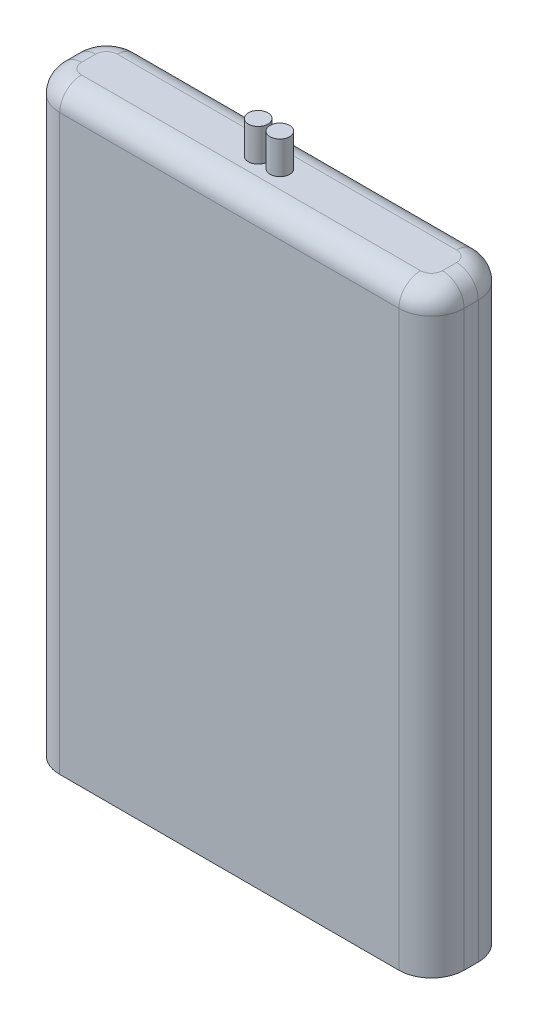
ISO-10303-21;
HEADER;
FILE_DESCRIPTION(('STEP AP214'),'2;1');
FILE_NAME('part.step','',(''),(''),'','','');
FILE_SCHEMA(('AUTOMOTIVE_DESIGN { 1 0 10303 214 1 1 1 1 }'));
ENDSEC;
DATA;
#1=APPLICATION_CONTEXT('core data for automotive mechanical design processes');
#2=APPLICATION_PROTOCOL_DEFINITION('international standard','automotive_design',2000,#1);
#3=PRODUCT_CONTEXT('',#1,'mechanical');
#4=PRODUCT('Part','Part','',(#3));
#5=PRODUCT_RELATED_PRODUCT_CATEGORY('part','',(#4));
#6=PRODUCT_DEFINITION_FORMATION('','',#4);
#7=PRODUCT_DEFINITION_CONTEXT('part definition',#1,'design');
#8=PRODUCT_DEFINITION('design','',#6,#7);
#9=PRODUCT_DEFINITION_SHAPE('','',#8);
#10=(LENGTH_UNIT() NAMED_UNIT(*) SI_UNIT(.MILLI.,.METRE.));
#11=(NAMED_UNIT(*) PLANE_ANGLE_UNIT() SI_UNIT($,.RADIAN.));
#12=(NAMED_UNIT(*) SI_UNIT($,.STERADIAN.) SOLID_ANGLE_UNIT());
#13=UNCERTAINTY_MEASURE_WITH_UNIT(LENGTH_MEASURE(1.E-05),#10,'distance_accuracy_value','');
#14=(GEOMETRIC_REPRESENTATION_CONTEXT(3) GLOBAL_UNCERTAINTY_ASSIGNED_CONTEXT((#13)) GLOBAL_UNIT_ASSIGNED_CONTEXT((#10,
#11,#12)) REPRESENTATION_CONTEXT('',''));
#15=CARTESIAN_POINT('',(0.,0.,0.));
#16=DIRECTION('',(0.,0.,1.));
#17=DIRECTION('',(1.,0.,0.));
#18=AXIS2_PLACEMENT_3D('',#15,#16,#17);
#19=CARTESIAN_POINT('',(18.58,27.335,3.65));
#20=DIRECTION('',(-1.,0.,0.));
#21=DIRECTION('',(0.,-1.,0.));
#22=AXIS2_PLACEMENT_3D('',#19,#20,#21);
#23=PLANE('',#22);
#24=DIRECTION('',(0.,1.,0.));
#25=VECTOR('',#24,1.);
#26=CARTESIAN_POINT('',(18.58,27.335,-0.65));
#27=LINE('',#26,#25);
#28=CARTESIAN_POINT('',(18.58,-27.335,-0.65));
#29=VERTEX_POINT('',#28);
#30=CARTESIAN_POINT('',(18.58,25.335,-0.65));
#31=VERTEX_POINT('',#30);
#32=EDGE_CURVE('E184',#29,#31,#27,.T.);
#33=ORIENTED_EDGE('',*,*,#32,.T.);
#34=DIRECTION('',(0.,0.,-1.));
#35=VECTOR('',#34,1.);
#36=CARTESIAN_POINT('',(18.58,25.335,3.65));
#37=LINE('',#36,#35);
#38=CARTESIAN_POINT('',(18.58,25.335,0.65));
#39=VERTEX_POINT('',#38);
#40=EDGE_CURVE('E217',#31,#39,#37,.F.);
#41=ORIENTED_EDGE('',*,*,#40,.T.);
#42=DIRECTION('',(0.,1.,0.));
#43=VECTOR('',#42,1.);
#44=CARTESIAN_POINT('',(18.58,-27.335,0.65));
#45=LINE('',#44,#43);
#46=CARTESIAN_POINT('',(18.58,-27.335,0.65));
#47=VERTEX_POINT('',#46);
#48=EDGE_CURVE('E181',#39,#47,#45,.F.);
#49=ORIENTED_EDGE('',*,*,#48,.T.);
#50=DIRECTION('',(0.,0.,-1.));
#51=VECTOR('',#50,1.);
#52=CARTESIAN_POINT('',(18.58,-27.335,3.65));
#53=LINE('',#52,#51);
#54=EDGE_CURVE('E152',#47,#29,#53,.T.);
#55=ORIENTED_EDGE('',*,*,#54,.T.);
#56=EDGE_LOOP('',(#33,#41,#49,#55));
#57=FACE_BOUND('',#56,.T.);
#58=ADVANCED_FACE('F41',(#57),#23,.F.);
#59=CARTESIAN_POINT('',(-18.58,27.335,3.65));
#60=DIRECTION('',(0.,-1.,0.));
#61=DIRECTION('',(0.,0.,-1.));
#62=AXIS2_PLACEMENT_3D('',#59,#60,#61);
#63=PLANE('',#62);
#64=CARTESIAN_POINT('',(1.,27.335,0.));
#65=DIRECTION('',(0.,-1.,0.));
#66=DIRECTION('',(0.,0.,-1.));
#67=AXIS2_PLACEMENT_3D('',#64,#65,#66);
#68=CIRCLE('',#67,0.900344027034095);
#69=CARTESIAN_POINT('',(1.,27.335,-0.900344027034095));
#70=VERTEX_POINT('',#69);
#71=EDGE_CURVE('E11',#70,#70,#68,.F.);
#72=ORIENTED_EDGE('',*,*,#71,.F.);
#73=EDGE_LOOP('',(#72));
#74=FACE_BOUND('',#73,.T.);
#75=CARTESIAN_POINT('',(-1.,27.335,0.));
#76=DIRECTION('',(0.,-1.,0.));
#77=DIRECTION('',(0.,0.,-1.));
#78=AXIS2_PLACEMENT_3D('',#75,#76,#77);
#79=CIRCLE('',#78,0.900344027034095);
#80=CARTESIAN_POINT('',(-1.,27.335,-0.900344027034095));
#81=VERTEX_POINT('',#80);
#82=EDGE_CURVE('E50',#81,#81,#79,.F.);
#83=ORIENTED_EDGE('',*,*,#82,.F.);
#84=EDGE_LOOP('',(#83));
#85=FACE_BOUND('',#84,.T.);
#86=DIRECTION('',(-1.,0.,0.));
#87=VECTOR('',#86,1.);
#88=CARTESIAN_POINT('',(15.58,27.335,1.65));
#89=LINE('',#88,#87);
#90=CARTESIAN_POINT('',(-15.58,27.335,1.65));
#91=VERTEX_POINT('',#90);
#92=CARTESIAN_POINT('',(15.58,27.335,1.65));
#93=VERTEX_POINT('',#92);
#94=EDGE_CURVE('E188',#91,#93,#89,.F.);
#95=ORIENTED_EDGE('',*,*,#94,.T.);
#96=CARTESIAN_POINT('',(15.58,27.335,0.65));
#97=DIRECTION('',(0.,-1.,0.));
#98=DIRECTION('',(0.,0.,-1.));
#99=AXIS2_PLACEMENT_3D('',#96,#97,#98);
#100=CIRCLE('',#99,1.);
#101=CARTESIAN_POINT('',(16.58,27.335,0.65));
#102=VERTEX_POINT('',#101);
#103=EDGE_CURVE('E209',#93,#102,#100,.F.);
#104=ORIENTED_EDGE('',*,*,#103,.T.);
#105=DIRECTION('',(0.,0.,-1.));
#106=VECTOR('',#105,1.);
#107=CARTESIAN_POINT('',(16.58,27.335,3.65));
#108=LINE('',#107,#106);
#109=CARTESIAN_POINT('',(16.58,27.335,-0.65));
#110=VERTEX_POINT('',#109);
#111=EDGE_CURVE('E206',#102,#110,#108,.T.);
#112=ORIENTED_EDGE('',*,*,#111,.T.);
#113=CARTESIAN_POINT('',(15.58,27.335,-0.65));
#114=DIRECTION('',(0.,-1.,0.));
#115=DIRECTION('',(0.,0.,-1.));
#116=AXIS2_PLACEMENT_3D('',#113,#114,#115);
#117=CIRCLE('',#116,1.);
#118=CARTESIAN_POINT('',(15.58,27.335,-1.65));
#119=VERTEX_POINT('',#118);
#120=EDGE_CURVE('E203',#110,#119,#117,.F.);
#121=ORIENTED_EDGE('',*,*,#120,.T.);
#122=DIRECTION('',(-1.,0.,0.));
#123=VECTOR('',#122,1.);
#124=CARTESIAN_POINT('',(-18.58,27.335,-1.65));
#125=LINE('',#124,#123);
#126=CARTESIAN_POINT('',(-15.58,27.335,-1.65));
#127=VERTEX_POINT('',#126);
#128=EDGE_CURVE('E200',#119,#127,#125,.T.);
#129=ORIENTED_EDGE('',*,*,#128,.T.);
#130=CARTESIAN_POINT('',(-15.58,27.335,-0.65));
#131=DIRECTION('',(0.,-1.,0.));
#132=DIRECTION('',(0.,0.,-1.));
#133=AXIS2_PLACEMENT_3D('',#130,#131,#132);
#134=CIRCLE('',#133,1.);
#135=CARTESIAN_POINT('',(-16.58,27.335,-0.65));
#136=VERTEX_POINT('',#135);
#137=EDGE_CURVE('E197',#127,#136,#134,.F.);
#138=ORIENTED_EDGE('',*,*,#137,.T.);
#139=DIRECTION('',(0.,0.,-1.));
#140=VECTOR('',#139,1.);
#141=CARTESIAN_POINT('',(-16.58,27.335,3.65));
#142=LINE('',#141,#140);
#143=CARTESIAN_POINT('',(-16.58,27.335,0.65));
#144=VERTEX_POINT('',#143);
#145=EDGE_CURVE('E194',#136,#144,#142,.F.);
#146=ORIENTED_EDGE('',*,*,#145,.T.);
#147=CARTESIAN_POINT('',(-15.58,27.335,0.65));
#148=DIRECTION('',(0.,-1.,0.));
#149=DIRECTION('',(0.,0.,-1.));
#150=AXIS2_PLACEMENT_3D('',#147,#148,#149);
#151=CIRCLE('',#150,1.);
#152=EDGE_CURVE('E191',#144,#91,#151,.F.);
#153=ORIENTED_EDGE('',*,*,#152,.T.);
#154=EDGE_LOOP('',(#95,#104,#112,#121,#129,#138,#146,#153));
#155=FACE_BOUND('',#154,.T.);
#156=ADVANCED_FACE('F273',(#74,#85,#155),#63,.F.);
#157=CARTESIAN_POINT('',(-18.58,27.335,3.65));
#158=DIRECTION('',(1.,0.,0.));
#159=DIRECTION('',(0.,1.,0.));
#160=AXIS2_PLACEMENT_3D('',#157,#158,#159);
#161=PLANE('',#160);
#162=DIRECTION('',(0.,-1.,0.));
#163=VECTOR('',#162,1.);
#164=CARTESIAN_POINT('',(-18.58,27.335,0.65));
#165=LINE('',#164,#163);
#166=CARTESIAN_POINT('',(-18.58,-27.335,0.65));
#167=VERTEX_POINT('',#166);
#168=CARTESIAN_POINT('',(-18.58,25.335,0.65));
#169=VERTEX_POINT('',#168);
#170=EDGE_CURVE('E146',#167,#169,#165,.F.);
#171=ORIENTED_EDGE('',*,*,#170,.T.);
#172=DIRECTION('',(0.,0.,-1.));
#173=VECTOR('',#172,1.);
#174=CARTESIAN_POINT('',(-18.58,25.335,3.65));
#175=LINE('',#174,#173);
#176=CARTESIAN_POINT('',(-18.58,25.335,-0.65));
#177=VERTEX_POINT('',#176);
#178=EDGE_CURVE('E229',#169,#177,#175,.T.);
#179=ORIENTED_EDGE('',*,*,#178,.T.);
#180=DIRECTION('',(0.,-1.,0.));
#181=VECTOR('',#180,1.);
#182=CARTESIAN_POINT('',(-18.58,27.335,-0.65));
#183=LINE('',#182,#181);
#184=CARTESIAN_POINT('',(-18.58,-27.335,-0.65));
#185=VERTEX_POINT('',#184);
#186=EDGE_CURVE('E149',#177,#185,#183,.T.);
#187=ORIENTED_EDGE('',*,*,#186,.T.);
#188=DIRECTION('',(0.,0.,-1.));
#189=VECTOR('',#188,1.);
#190=CARTESIAN_POINT('',(-18.58,-27.335,3.65));
#191=LINE('',#190,#189);
#192=EDGE_CURVE('E137',#167,#185,#191,.T.);
#193=ORIENTED_EDGE('',*,*,#192,.F.);
#194=EDGE_LOOP('',(#171,#179,#187,#193));
#195=FACE_BOUND('',#194,.T.);
#196=ADVANCED_FACE('F145',(#195),#161,.F.);
#197=CARTESIAN_POINT('',(-18.58,-27.335,3.65));
#198=DIRECTION('',(0.,1.,0.));
#199=DIRECTION('',(0.,0.,1.));
#200=AXIS2_PLACEMENT_3D('',#197,#198,#199);
#201=PLANE('',#200);
#202=ORIENTED_EDGE('',*,*,#192,.T.);
#203=CARTESIAN_POINT('',(-15.58,-27.335,-0.65));
#204=DIRECTION('',(0.,1.,0.));
#205=DIRECTION('',(0.,0.,1.));
#206=AXIS2_PLACEMENT_3D('',#203,#204,#205);
#207=CIRCLE('',#206,3.);
#208=CARTESIAN_POINT('',(-15.58,-27.335,-3.65));
#209=VERTEX_POINT('',#208);
#210=EDGE_CURVE('E141',#185,#209,#207,.F.);
#211=ORIENTED_EDGE('',*,*,#210,.T.);
#212=DIRECTION('',(1.,0.,0.));
#213=VECTOR('',#212,1.);
#214=CARTESIAN_POINT('',(-18.58,-27.335,-3.65));
#215=LINE('',#214,#213);
#216=CARTESIAN_POINT('',(15.58,-27.335,-3.65));
#217=VERTEX_POINT('',#216);
#218=EDGE_CURVE('E266',#209,#217,#215,.T.);
#219=ORIENTED_EDGE('',*,*,#218,.T.);
#220=CARTESIAN_POINT('',(15.58,-27.335,-0.65));
#221=DIRECTION('',(0.,1.,0.));
#222=DIRECTION('',(0.,0.,1.));
#223=AXIS2_PLACEMENT_3D('',#220,#221,#222);
#224=CIRCLE('',#223,3.);
#225=EDGE_CURVE('E142',#217,#29,#224,.F.);
#226=ORIENTED_EDGE('',*,*,#225,.T.);
#227=ORIENTED_EDGE('',*,*,#54,.F.);
#228=CARTESIAN_POINT('',(15.58,-27.335,0.65));
#229=DIRECTION('',(0.,1.,0.));
#230=DIRECTION('',(0.,0.,1.));
#231=AXIS2_PLACEMENT_3D('',#228,#229,#230);
#232=CIRCLE('',#231,3.);
#233=CARTESIAN_POINT('',(15.58,-27.335,3.65));
#234=VERTEX_POINT('',#233);
#235=EDGE_CURVE('E158',#47,#234,#232,.F.);
#236=ORIENTED_EDGE('',*,*,#235,.T.);
#237=DIRECTION('',(1.,0.,0.));
#238=VECTOR('',#237,1.);
#239=CARTESIAN_POINT('',(-18.58,-27.335,3.65));
#240=LINE('',#239,#238);
#241=CARTESIAN_POINT('',(-15.58,-27.335,3.65));
#242=VERTEX_POINT('',#241);
#243=EDGE_CURVE('E139',#242,#234,#240,.T.);
#244=ORIENTED_EDGE('',*,*,#243,.F.);
#245=CARTESIAN_POINT('',(-15.58,-27.335,0.65));
#246=DIRECTION('',(0.,1.,0.));
#247=DIRECTION('',(0.,0.,1.));
#248=AXIS2_PLACEMENT_3D('',#245,#246,#247);
#249=CIRCLE('',#248,3.);
#250=EDGE_CURVE('E134',#242,#167,#249,.F.);
#251=ORIENTED_EDGE('',*,*,#250,.T.);
#252=EDGE_LOOP('',(#202,#211,#219,#226,#227,#236,#244,#251));
#253=FACE_BOUND('',#252,.T.);
#254=ADVANCED_FACE('F136',(#253),#201,.F.);
#255=CARTESIAN_POINT('',(0.,0.,3.65));
#256=DIRECTION('',(0.,0.,1.));
#257=DIRECTION('',(1.,0.,0.));
#258=AXIS2_PLACEMENT_3D('',#255,#256,#257);
#259=PLANE('',#258);
#260=DIRECTION('',(0.,1.,0.));
#261=VECTOR('',#260,1.);
#262=CARTESIAN_POINT('',(15.58,27.335,3.65));
#263=LINE('',#262,#261);
#264=CARTESIAN_POINT('',(15.58,25.335,3.65));
#265=VERTEX_POINT('',#264);
#266=EDGE_CURVE('E175',#234,#265,#263,.T.);
#267=ORIENTED_EDGE('',*,*,#266,.T.);
#268=DIRECTION('',(-1.,0.,0.));
#269=VECTOR('',#268,1.);
#270=CARTESIAN_POINT('',(-15.58,25.335,3.65));
#271=LINE('',#270,#269);
#272=CARTESIAN_POINT('',(-15.58,25.335,3.65));
#273=VERTEX_POINT('',#272);
#274=EDGE_CURVE('E57',#265,#273,#271,.T.);
#275=ORIENTED_EDGE('',*,*,#274,.T.);
#276=DIRECTION('',(0.,-1.,0.));
#277=VECTOR('',#276,1.);
#278=CARTESIAN_POINT('',(-15.58,-27.335,3.65));
#279=LINE('',#278,#277);
#280=EDGE_CURVE('E178',#273,#242,#279,.T.);
#281=ORIENTED_EDGE('',*,*,#280,.T.);
#282=ORIENTED_EDGE('',*,*,#243,.T.);
#283=EDGE_LOOP('',(#267,#275,#281,#282));
#284=FACE_BOUND('',#283,.T.);
#285=ADVANCED_FACE('F468',(#284),#259,.T.);
#286=CARTESIAN_POINT('',(0.,0.,-3.65));
#287=DIRECTION('',(0.,0.,1.));
#288=DIRECTION('',(1.,0.,0.));
#289=AXIS2_PLACEMENT_3D('',#286,#287,#288);
#290=PLANE('',#289);
#291=DIRECTION('',(0.,-1.,0.));
#292=VECTOR('',#291,1.);
#293=CARTESIAN_POINT('',(-15.58,0.,-3.65));
#294=LINE('',#293,#292);
#295=CARTESIAN_POINT('',(-15.58,25.335,-3.65));
#296=VERTEX_POINT('',#295);
#297=EDGE_CURVE('E171',#209,#296,#294,.F.);
#298=ORIENTED_EDGE('',*,*,#297,.T.);
#299=DIRECTION('',(-1.,0.,0.));
#300=VECTOR('',#299,1.);
#301=CARTESIAN_POINT('',(0.,25.335,-3.65));
#302=LINE('',#301,#300);
#303=CARTESIAN_POINT('',(15.58,25.335,-3.65));
#304=VERTEX_POINT('',#303);
#305=EDGE_CURVE('E223',#296,#304,#302,.F.);
#306=ORIENTED_EDGE('',*,*,#305,.T.);
#307=DIRECTION('',(0.,1.,0.));
#308=VECTOR('',#307,1.);
#309=CARTESIAN_POINT('',(15.58,0.,-3.65));
#310=LINE('',#309,#308);
#311=EDGE_CURVE('E168',#304,#217,#310,.F.);
#312=ORIENTED_EDGE('',*,*,#311,.T.);
#313=ORIENTED_EDGE('',*,*,#218,.F.);
#314=EDGE_LOOP('',(#298,#306,#312,#313));
#315=FACE_BOUND('',#314,.T.);
#316=ADVANCED_FACE('F332',(#315),#290,.F.);
#317=CARTESIAN_POINT('',(-15.58,27.335,-0.65));
#318=DIRECTION('',(0.,-1.,0.));
#319=DIRECTION('',(1.,0.,0.));
#320=AXIS2_PLACEMENT_3D('',#317,#318,#319);
#321=CYLINDRICAL_SURFACE('',#320,3.);
#322=ORIENTED_EDGE('',*,*,#186,.F.);
#323=CARTESIAN_POINT('',(-15.58,25.335,-0.65));
#324=DIRECTION('',(0.,-1.,0.));
#325=DIRECTION('',(0.,0.,-1.));
#326=AXIS2_PLACEMENT_3D('',#323,#324,#325);
#327=CIRCLE('',#326,3.);
#328=EDGE_CURVE('E226',#177,#296,#327,.T.);
#329=ORIENTED_EDGE('',*,*,#328,.T.);
#330=ORIENTED_EDGE('',*,*,#297,.F.);
#331=ORIENTED_EDGE('',*,*,#210,.F.);
#332=EDGE_LOOP('',(#322,#329,#330,#331));
#333=FACE_BOUND('',#332,.T.);
#334=ADVANCED_FACE('F329',(#333),#321,.T.);
#335=CARTESIAN_POINT('',(-15.58,0.,0.65));
#336=DIRECTION('',(0.,1.,0.));
#337=DIRECTION('',(-1.,0.,0.));
#338=AXIS2_PLACEMENT_3D('',#335,#336,#337);
#339=CYLINDRICAL_SURFACE('',#338,3.);
#340=ORIENTED_EDGE('',*,*,#280,.F.);
#341=CARTESIAN_POINT('',(-15.58,25.335,0.65));
#342=DIRECTION('',(0.,-1.,0.));
#343=DIRECTION('',(0.,0.,-1.));
#344=AXIS2_PLACEMENT_3D('',#341,#342,#343);
#345=CIRCLE('',#344,3.);
#346=EDGE_CURVE('E64',#273,#169,#345,.T.);
#347=ORIENTED_EDGE('',*,*,#346,.T.);
#348=ORIENTED_EDGE('',*,*,#170,.F.);
#349=ORIENTED_EDGE('',*,*,#250,.F.);
#350=EDGE_LOOP('',(#340,#347,#348,#349));
#351=FACE_BOUND('',#350,.T.);
#352=ADVANCED_FACE('F154',(#351),#339,.T.);
#353=CARTESIAN_POINT('',(15.58,27.335,-0.65));
#354=DIRECTION('',(0.,1.,0.));
#355=DIRECTION('',(-1.,0.,0.));
#356=AXIS2_PLACEMENT_3D('',#353,#354,#355);
#357=CYLINDRICAL_SURFACE('',#356,3.);
#358=ORIENTED_EDGE('',*,*,#311,.F.);
#359=CARTESIAN_POINT('',(15.58,25.335,-0.65));
#360=DIRECTION('',(0.,-1.,0.));
#361=DIRECTION('',(0.,0.,-1.));
#362=AXIS2_PLACEMENT_3D('',#359,#360,#361);
#363=CIRCLE('',#362,3.);
#364=EDGE_CURVE('E220',#304,#31,#363,.T.);
#365=ORIENTED_EDGE('',*,*,#364,.T.);
#366=ORIENTED_EDGE('',*,*,#32,.F.);
#367=ORIENTED_EDGE('',*,*,#225,.F.);
#368=EDGE_LOOP('',(#358,#365,#366,#367));
#369=FACE_BOUND('',#368,.T.);
#370=ADVANCED_FACE('F336',(#369),#357,.T.);
#371=CARTESIAN_POINT('',(15.58,0.,0.65));
#372=DIRECTION('',(0.,-1.,0.));
#373=DIRECTION('',(1.,0.,0.));
#374=AXIS2_PLACEMENT_3D('',#371,#372,#373);
#375=CYLINDRICAL_SURFACE('',#374,3.);
#376=ORIENTED_EDGE('',*,*,#48,.F.);
#377=CARTESIAN_POINT('',(15.58,25.335,0.65));
#378=DIRECTION('',(0.,-1.,0.));
#379=DIRECTION('',(0.,0.,-1.));
#380=AXIS2_PLACEMENT_3D('',#377,#378,#379);
#381=CIRCLE('',#380,3.);
#382=EDGE_CURVE('E213',#39,#265,#381,.T.);
#383=ORIENTED_EDGE('',*,*,#382,.T.);
#384=ORIENTED_EDGE('',*,*,#266,.F.);
#385=ORIENTED_EDGE('',*,*,#235,.F.);
#386=EDGE_LOOP('',(#376,#383,#384,#385));
#387=FACE_BOUND('',#386,.T.);
#388=ADVANCED_FACE('F339',(#387),#375,.T.);
#389=CARTESIAN_POINT('',(-15.58,25.335,-0.65));
#390=DIRECTION('',(0.,-1.,0.));
#391=DIRECTION('',(0.,0.,-1.));
#392=AXIS2_PLACEMENT_3D('',#389,#390,#391);
#393=DEGENERATE_TOROIDAL_SURFACE('',#392,1.,2.,.T.);
#394=CARTESIAN_POINT('',(-15.58,25.335,-1.65));
#395=DIRECTION('',(1.,0.,0.));
#396=DIRECTION('',(0.,0.,-1.));
#397=AXIS2_PLACEMENT_3D('',#394,#395,#396);
#398=CIRCLE('',#397,2.);
#399=EDGE_CURVE('E259',#296,#127,#398,.T.);
#400=ORIENTED_EDGE('',*,*,#399,.F.);
#401=ORIENTED_EDGE('',*,*,#328,.F.);
#402=CARTESIAN_POINT('',(-16.58,25.335,-0.65));
#403=DIRECTION('',(0.,0.,1.));
#404=DIRECTION('',(1.,0.,0.));
#405=AXIS2_PLACEMENT_3D('',#402,#403,#404);
#406=CIRCLE('',#405,2.);
#407=EDGE_CURVE('E263',#136,#177,#406,.T.);
#408=ORIENTED_EDGE('',*,*,#407,.F.);
#409=ORIENTED_EDGE('',*,*,#137,.F.);
#410=EDGE_LOOP('',(#400,#401,#408,#409));
#411=FACE_BOUND('',#410,.T.);
#412=ADVANCED_FACE('F43',(#411),#393,.T.);
#413=CARTESIAN_POINT('',(-16.58,25.335,3.65));
#414=DIRECTION('',(0.,0.,-1.));
#415=DIRECTION('',(-1.,0.,0.));
#416=AXIS2_PLACEMENT_3D('',#413,#414,#415);
#417=CYLINDRICAL_SURFACE('',#416,2.);
#418=ORIENTED_EDGE('',*,*,#407,.T.);
#419=ORIENTED_EDGE('',*,*,#178,.F.);
#420=CARTESIAN_POINT('',(-16.58,25.335,0.65));
#421=DIRECTION('',(0.,0.,1.));
#422=DIRECTION('',(1.,0.,0.));
#423=AXIS2_PLACEMENT_3D('',#420,#421,#422);
#424=CIRCLE('',#423,2.);
#425=EDGE_CURVE('E255',#144,#169,#424,.T.);
#426=ORIENTED_EDGE('',*,*,#425,.F.);
#427=ORIENTED_EDGE('',*,*,#145,.F.);
#428=EDGE_LOOP('',(#418,#419,#426,#427));
#429=FACE_BOUND('',#428,.T.);
#430=ADVANCED_FACE('F311',(#429),#417,.T.);
#431=CARTESIAN_POINT('',(-18.58,25.335,-1.65));
#432=DIRECTION('',(-1.,0.,0.));
#433=DIRECTION('',(0.,0.,1.));
#434=AXIS2_PLACEMENT_3D('',#431,#432,#433);
#435=CYLINDRICAL_SURFACE('',#434,2.);
#436=ORIENTED_EDGE('',*,*,#399,.T.);
#437=ORIENTED_EDGE('',*,*,#128,.F.);
#438=CARTESIAN_POINT('',(15.58,25.335,-1.65));
#439=DIRECTION('',(1.,0.,0.));
#440=DIRECTION('',(0.,0.,-1.));
#441=AXIS2_PLACEMENT_3D('',#438,#439,#440);
#442=CIRCLE('',#441,2.);
#443=EDGE_CURVE('E251',#304,#119,#442,.T.);
#444=ORIENTED_EDGE('',*,*,#443,.F.);
#445=ORIENTED_EDGE('',*,*,#305,.F.);
#446=EDGE_LOOP('',(#436,#437,#444,#445));
#447=FACE_BOUND('',#446,.T.);
#448=ADVANCED_FACE('F302',(#447),#435,.T.);
#449=CARTESIAN_POINT('',(-15.58,25.335,0.65));
#450=DIRECTION('',(0.,-1.,0.));
#451=DIRECTION('',(0.,0.,-1.));
#452=AXIS2_PLACEMENT_3D('',#449,#450,#451);
#453=DEGENERATE_TOROIDAL_SURFACE('',#452,1.,2.,.T.);
#454=ORIENTED_EDGE('',*,*,#425,.T.);
#455=ORIENTED_EDGE('',*,*,#346,.F.);
#456=CARTESIAN_POINT('',(-15.58,25.335,1.65));
#457=DIRECTION('',(1.,0.,0.));
#458=DIRECTION('',(0.,0.,-1.));
#459=AXIS2_PLACEMENT_3D('',#456,#457,#458);
#460=CIRCLE('',#459,2.);
#461=EDGE_CURVE('E247',#91,#273,#460,.T.);
#462=ORIENTED_EDGE('',*,*,#461,.F.);
#463=ORIENTED_EDGE('',*,*,#152,.F.);
#464=EDGE_LOOP('',(#454,#455,#462,#463));
#465=FACE_BOUND('',#464,.T.);
#466=ADVANCED_FACE('F313',(#465),#453,.T.);
#467=CARTESIAN_POINT('',(15.58,25.335,-0.65));
#468=DIRECTION('',(0.,-1.,0.));
#469=DIRECTION('',(0.,0.,-1.));
#470=AXIS2_PLACEMENT_3D('',#467,#468,#469);
#471=DEGENERATE_TOROIDAL_SURFACE('',#470,1.,2.,.T.);
#472=ORIENTED_EDGE('',*,*,#443,.T.);
#473=ORIENTED_EDGE('',*,*,#120,.F.);
#474=CARTESIAN_POINT('',(16.58,25.335,-0.65));
#475=DIRECTION('',(0.,0.,1.));
#476=DIRECTION('',(1.,0.,0.));
#477=AXIS2_PLACEMENT_3D('',#474,#475,#476);
#478=CIRCLE('',#477,2.);
#479=EDGE_CURVE('E243',#31,#110,#478,.T.);
#480=ORIENTED_EDGE('',*,*,#479,.F.);
#481=ORIENTED_EDGE('',*,*,#364,.F.);
#482=EDGE_LOOP('',(#472,#473,#480,#481));
#483=FACE_BOUND('',#482,.T.);
#484=ADVANCED_FACE('F297',(#483),#471,.T.);
#485=CARTESIAN_POINT('',(0.,25.335,1.65));
#486=DIRECTION('',(1.,0.,0.));
#487=DIRECTION('',(0.,0.,-1.));
#488=AXIS2_PLACEMENT_3D('',#485,#486,#487);
#489=CYLINDRICAL_SURFACE('',#488,2.);
#490=ORIENTED_EDGE('',*,*,#461,.T.);
#491=ORIENTED_EDGE('',*,*,#274,.F.);
#492=CARTESIAN_POINT('',(15.58,25.335,1.65));
#493=DIRECTION('',(1.,0.,0.));
#494=DIRECTION('',(0.,0.,-1.));
#495=AXIS2_PLACEMENT_3D('',#492,#493,#494);
#496=CIRCLE('',#495,2.);
#497=EDGE_CURVE('E239',#93,#265,#496,.T.);
#498=ORIENTED_EDGE('',*,*,#497,.F.);
#499=ORIENTED_EDGE('',*,*,#94,.F.);
#500=EDGE_LOOP('',(#490,#491,#498,#499));
#501=FACE_BOUND('',#500,.T.);
#502=ADVANCED_FACE('F284',(#501),#489,.T.);
#503=CARTESIAN_POINT('',(16.58,25.335,3.65));
#504=DIRECTION('',(0.,0.,-1.));
#505=DIRECTION('',(-1.,0.,0.));
#506=AXIS2_PLACEMENT_3D('',#503,#504,#505);
#507=CYLINDRICAL_SURFACE('',#506,2.);
#508=ORIENTED_EDGE('',*,*,#479,.T.);
#509=ORIENTED_EDGE('',*,*,#111,.F.);
#510=CARTESIAN_POINT('',(16.58,25.335,0.65));
#511=DIRECTION('',(0.,0.,1.));
#512=DIRECTION('',(1.,0.,0.));
#513=AXIS2_PLACEMENT_3D('',#510,#511,#512);
#514=CIRCLE('',#513,2.);
#515=EDGE_CURVE('E236',#39,#102,#514,.T.);
#516=ORIENTED_EDGE('',*,*,#515,.F.);
#517=ORIENTED_EDGE('',*,*,#40,.F.);
#518=EDGE_LOOP('',(#508,#509,#516,#517));
#519=FACE_BOUND('',#518,.T.);
#520=ADVANCED_FACE('F292',(#519),#507,.T.);
#521=CARTESIAN_POINT('',(15.58,25.335,0.65));
#522=DIRECTION('',(0.,-1.,0.));
#523=DIRECTION('',(0.,0.,-1.));
#524=AXIS2_PLACEMENT_3D('',#521,#522,#523);
#525=DEGENERATE_TOROIDAL_SURFACE('',#524,1.,2.,.T.);
#526=ORIENTED_EDGE('',*,*,#497,.T.);
#527=ORIENTED_EDGE('',*,*,#382,.F.);
#528=ORIENTED_EDGE('',*,*,#515,.T.);
#529=ORIENTED_EDGE('',*,*,#103,.F.);
#530=EDGE_LOOP('',(#526,#527,#528,#529));
#531=FACE_BOUND('',#530,.T.);
#532=ADVANCED_FACE('F287',(#531),#525,.T.);
#533=CARTESIAN_POINT('',(-1.,30.335,0.));
#534=DIRECTION('',(0.,-1.,0.));
#535=DIRECTION('',(0.,0.,-1.));
#536=AXIS2_PLACEMENT_3D('',#533,#534,#535);
#537=CYLINDRICAL_SURFACE('',#536,0.900344027034095);
#538=CARTESIAN_POINT('',(-1.,30.335,0.));
#539=DIRECTION('',(0.,1.,0.));
#540=DIRECTION('',(0.,0.,1.));
#541=AXIS2_PLACEMENT_3D('',#538,#539,#540);
#542=CIRCLE('',#541,0.900344027034095);
#543=CARTESIAN_POINT('',(-1.,30.335,0.900344027034095));
#544=VERTEX_POINT('',#543);
#545=EDGE_CURVE('E240',#544,#544,#542,.T.);
#546=ORIENTED_EDGE('',*,*,#545,.F.);
#547=EDGE_LOOP('',(#546));
#548=FACE_BOUND('',#547,.T.);
#549=ORIENTED_EDGE('',*,*,#82,.T.);
#550=EDGE_LOOP('',(#549));
#551=FACE_BOUND('',#550,.T.);
#552=ADVANCED_FACE('F271',(#548,#551),#537,.T.);
#553=CARTESIAN_POINT('',(-1.,30.335,0.));
#554=DIRECTION('',(0.,1.,0.));
#555=DIRECTION('',(0.,0.,1.));
#556=AXIS2_PLACEMENT_3D('',#553,#554,#555);
#557=PLANE('',#556);
#558=ORIENTED_EDGE('',*,*,#545,.T.);
#559=EDGE_LOOP('',(#558));
#560=FACE_BOUND('',#559,.T.);
#561=ADVANCED_FACE('F368',(#560),#557,.T.);
#562=CARTESIAN_POINT('',(1.,30.335,0.));
#563=DIRECTION('',(0.,-1.,0.));
#564=DIRECTION('',(0.,0.,-1.));
#565=AXIS2_PLACEMENT_3D('',#562,#563,#564);
#566=CYLINDRICAL_SURFACE('',#565,0.900344027034095);
#567=CARTESIAN_POINT('',(1.,30.335,0.));
#568=DIRECTION('',(0.,1.,0.));
#569=DIRECTION('',(0.,0.,1.));
#570=AXIS2_PLACEMENT_3D('',#567,#568,#569);
#571=CIRCLE('',#570,0.900344027034095);
#572=CARTESIAN_POINT('',(1.,30.335,0.900344027034095));
#573=VERTEX_POINT('',#572);
#574=EDGE_CURVE('E528',#573,#573,#571,.T.);
#575=ORIENTED_EDGE('',*,*,#574,.F.);
#576=EDGE_LOOP('',(#575));
#577=FACE_BOUND('',#576,.T.);
#578=ORIENTED_EDGE('',*,*,#71,.T.);
#579=EDGE_LOOP('',(#578));
#580=FACE_BOUND('',#579,.T.);
#581=ADVANCED_FACE('F376',(#577,#580),#566,.T.);
#582=CARTESIAN_POINT('',(1.,30.335,0.));
#583=DIRECTION('',(0.,1.,0.));
#584=DIRECTION('',(0.,0.,1.));
#585=AXIS2_PLACEMENT_3D('',#582,#583,#584);
#586=PLANE('',#585);
#587=ORIENTED_EDGE('',*,*,#574,.T.);
#588=EDGE_LOOP('',(#587));
#589=FACE_BOUND('',#588,.T.);
#590=ADVANCED_FACE('F384',(#589),#586,.T.);
#591=CLOSED_SHELL('',(#58,#156,#196,#254,#285,#316,#334,#352,#370,#388,#412,#430,#448,#466,#484,
#502,#520,#532,#552,#561,#581,#590));
#592=MANIFOLD_SOLID_BREP('B2',#591);
#593=ADVANCED_BREP_SHAPE_REPRESENTATION('',(#18,#592),#14);
#594=SHAPE_DEFINITION_REPRESENTATION(#9,#593);
ENDSEC;
END-ISO-10303-21;
